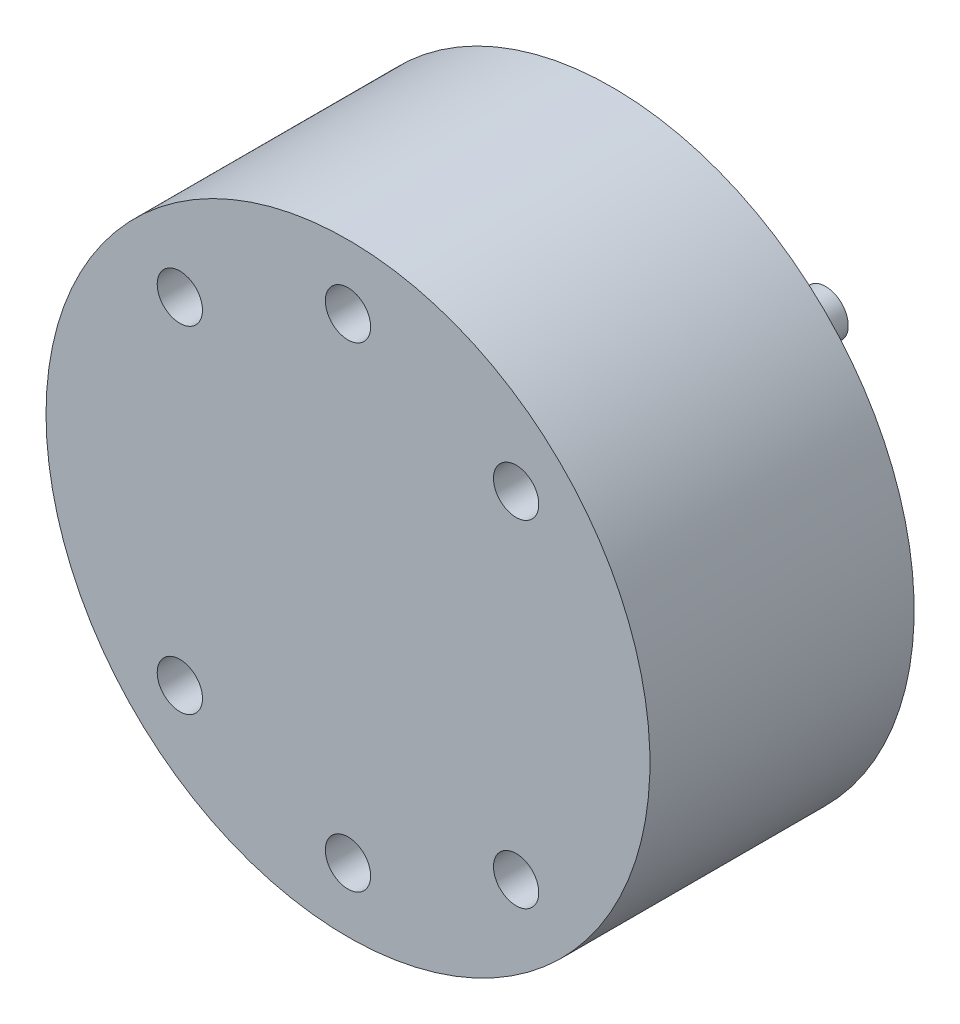
ISO-10303-21;
HEADER;
FILE_DESCRIPTION(('STEP AP214'),'2;1');
FILE_NAME('part.step','',(''),(''),'','','');
FILE_SCHEMA(('AUTOMOTIVE_DESIGN { 1 0 10303 214 1 1 1 1 }'));
ENDSEC;
DATA;
#1=APPLICATION_CONTEXT('core data for automotive mechanical design processes');
#2=APPLICATION_PROTOCOL_DEFINITION('international standard','automotive_design',2000,#1);
#3=PRODUCT_CONTEXT('',#1,'mechanical');
#4=PRODUCT('Part','Part','',(#3));
#5=PRODUCT_RELATED_PRODUCT_CATEGORY('part','',(#4));
#6=PRODUCT_DEFINITION_FORMATION('','',#4);
#7=PRODUCT_DEFINITION_CONTEXT('part definition',#1,'design');
#8=PRODUCT_DEFINITION('design','',#6,#7);
#9=PRODUCT_DEFINITION_SHAPE('','',#8);
#10=(LENGTH_UNIT() NAMED_UNIT(*) SI_UNIT(.MILLI.,.METRE.));
#11=(NAMED_UNIT(*) PLANE_ANGLE_UNIT() SI_UNIT($,.RADIAN.));
#12=(NAMED_UNIT(*) SI_UNIT($,.STERADIAN.) SOLID_ANGLE_UNIT());
#13=UNCERTAINTY_MEASURE_WITH_UNIT(LENGTH_MEASURE(1.E-05),#10,'distance_accuracy_value','');
#14=(GEOMETRIC_REPRESENTATION_CONTEXT(3) GLOBAL_UNCERTAINTY_ASSIGNED_CONTEXT((#13)) GLOBAL_UNIT_ASSIGNED_CONTEXT((#10,
#11,#12)) REPRESENTATION_CONTEXT('',''));
#15=CARTESIAN_POINT('',(0.,0.,0.));
#16=DIRECTION('',(0.,0.,1.));
#17=DIRECTION('',(1.,0.,0.));
#18=AXIS2_PLACEMENT_3D('',#15,#16,#17);
#19=CARTESIAN_POINT('',(0.,0.,0.));
#20=DIRECTION('',(0.,0.,1.));
#21=DIRECTION('',(1.,0.,0.));
#22=AXIS2_PLACEMENT_3D('',#19,#20,#21);
#23=PLANE('',#22);
#24=CARTESIAN_POINT('',(-22.2738636073763,22.2738636073763,0.));
#25=DIRECTION('',(0.,0.,-1.));
#26=DIRECTION('',(1.,0.,0.));
#27=AXIS2_PLACEMENT_3D('',#24,#25,#26);
#28=CIRCLE('',#27,3.);
#29=CARTESIAN_POINT('',(-25.2738636073763,22.2738636073763,0.));
#30=VERTEX_POINT('',#29);
#31=EDGE_CURVE('E175',#30,#30,#28,.T.);
#32=ORIENTED_EDGE('',*,*,#31,.F.);
#33=EDGE_LOOP('',(#32));
#34=FACE_BOUND('',#33,.T.);
#35=CARTESIAN_POINT('',(0.,-31.5,0.));
#36=DIRECTION('',(0.,0.,-1.));
#37=DIRECTION('',(1.,0.,0.));
#38=AXIS2_PLACEMENT_3D('',#35,#36,#37);
#39=CIRCLE('',#38,3.);
#40=CARTESIAN_POINT('',(-3.,-31.5,0.));
#41=VERTEX_POINT('',#40);
#42=EDGE_CURVE('E146',#41,#41,#39,.T.);
#43=ORIENTED_EDGE('',*,*,#42,.F.);
#44=EDGE_LOOP('',(#43));
#45=FACE_BOUND('',#44,.T.);
#46=CARTESIAN_POINT('',(22.2738636073763,22.2738636073763,0.));
#47=DIRECTION('',(0.,0.,-1.));
#48=DIRECTION('',(1.,0.,0.));
#49=AXIS2_PLACEMENT_3D('',#46,#47,#48);
#50=CIRCLE('',#49,3.);
#51=CARTESIAN_POINT('',(19.2738636073762,22.2738636073763,0.));
#52=VERTEX_POINT('',#51);
#53=EDGE_CURVE('E19',#52,#52,#50,.T.);
#54=ORIENTED_EDGE('',*,*,#53,.F.);
#55=EDGE_LOOP('',(#54));
#56=FACE_BOUND('',#55,.T.);
#57=CARTESIAN_POINT('',(22.2738636073762,-22.2738636073763,0.));
#58=DIRECTION('',(0.,0.,-1.));
#59=DIRECTION('',(1.,0.,0.));
#60=AXIS2_PLACEMENT_3D('',#57,#58,#59);
#61=CIRCLE('',#60,3.);
#62=CARTESIAN_POINT('',(19.2738636073762,-22.2738636073763,0.));
#63=VERTEX_POINT('',#62);
#64=EDGE_CURVE('E195',#63,#63,#61,.T.);
#65=ORIENTED_EDGE('',*,*,#64,.F.);
#66=EDGE_LOOP('',(#65));
#67=FACE_BOUND('',#66,.T.);
#68=CARTESIAN_POINT('',(-22.2738636073763,-22.2738636073762,0.));
#69=DIRECTION('',(0.,0.,-1.));
#70=DIRECTION('',(1.,0.,0.));
#71=AXIS2_PLACEMENT_3D('',#68,#69,#70);
#72=CIRCLE('',#71,3.);
#73=CARTESIAN_POINT('',(-25.2738636073763,-22.2738636073762,0.));
#74=VERTEX_POINT('',#73);
#75=EDGE_CURVE('E136',#74,#74,#72,.T.);
#76=ORIENTED_EDGE('',*,*,#75,.F.);
#77=EDGE_LOOP('',(#76));
#78=FACE_BOUND('',#77,.T.);
#79=CARTESIAN_POINT('',(0.,31.5,0.));
#80=DIRECTION('',(0.,0.,-1.));
#81=DIRECTION('',(1.,0.,0.));
#82=AXIS2_PLACEMENT_3D('',#79,#80,#81);
#83=CIRCLE('',#82,3.);
#84=CARTESIAN_POINT('',(-3.,31.5,0.));
#85=VERTEX_POINT('',#84);
#86=EDGE_CURVE('E167',#85,#85,#83,.T.);
#87=ORIENTED_EDGE('',*,*,#86,.F.);
#88=EDGE_LOOP('',(#87));
#89=FACE_BOUND('',#88,.T.);
#90=CARTESIAN_POINT('',(0.,0.,0.));
#91=DIRECTION('',(0.,0.,1.));
#92=DIRECTION('',(1.,0.,0.));
#93=AXIS2_PLACEMENT_3D('',#90,#91,#92);
#94=CIRCLE('',#93,40.);
#95=CARTESIAN_POINT('',(-40.,0.,0.));
#96=VERTEX_POINT('',#95);
#97=EDGE_CURVE('E9',#96,#96,#94,.T.);
#98=ORIENTED_EDGE('',*,*,#97,.F.);
#99=EDGE_LOOP('',(#98));
#100=FACE_BOUND('',#99,.T.);
#101=ADVANCED_FACE('F15',(#34,#45,#56,#67,#78,#89,#100),#23,.F.);
#102=CARTESIAN_POINT('',(0.,0.,35.));
#103=DIRECTION('',(0.,0.,1.));
#104=DIRECTION('',(1.,0.,0.));
#105=AXIS2_PLACEMENT_3D('',#102,#103,#104);
#106=PLANE('',#105);
#107=CARTESIAN_POINT('',(-22.2738636073763,22.2738636073763,35.));
#108=DIRECTION('',(0.,0.,-1.));
#109=DIRECTION('',(1.,0.,0.));
#110=AXIS2_PLACEMENT_3D('',#107,#108,#109);
#111=CIRCLE('',#110,3.);
#112=CARTESIAN_POINT('',(-25.2738636073763,22.2738636073763,35.));
#113=VERTEX_POINT('',#112);
#114=EDGE_CURVE('E164',#113,#113,#111,.T.);
#115=ORIENTED_EDGE('',*,*,#114,.T.);
#116=EDGE_LOOP('',(#115));
#117=FACE_BOUND('',#116,.T.);
#118=CARTESIAN_POINT('',(0.,-31.5,35.));
#119=DIRECTION('',(0.,0.,-1.));
#120=DIRECTION('',(1.,0.,0.));
#121=AXIS2_PLACEMENT_3D('',#118,#119,#120);
#122=CIRCLE('',#121,3.);
#123=CARTESIAN_POINT('',(-3.,-31.5,35.));
#124=VERTEX_POINT('',#123);
#125=EDGE_CURVE('E147',#124,#124,#122,.T.);
#126=ORIENTED_EDGE('',*,*,#125,.T.);
#127=EDGE_LOOP('',(#126));
#128=FACE_BOUND('',#127,.T.);
#129=CARTESIAN_POINT('',(22.2738636073763,22.2738636073763,35.));
#130=DIRECTION('',(0.,0.,-1.));
#131=DIRECTION('',(1.,0.,0.));
#132=AXIS2_PLACEMENT_3D('',#129,#130,#131);
#133=CIRCLE('',#132,3.);
#134=CARTESIAN_POINT('',(19.2738636073763,22.2738636073763,35.));
#135=VERTEX_POINT('',#134);
#136=EDGE_CURVE('E133',#135,#135,#133,.T.);
#137=ORIENTED_EDGE('',*,*,#136,.T.);
#138=EDGE_LOOP('',(#137));
#139=FACE_BOUND('',#138,.T.);
#140=CARTESIAN_POINT('',(22.2738636073762,-22.2738636073763,35.));
#141=DIRECTION('',(0.,0.,-1.));
#142=DIRECTION('',(1.,0.,0.));
#143=AXIS2_PLACEMENT_3D('',#140,#141,#142);
#144=CIRCLE('',#143,3.);
#145=CARTESIAN_POINT('',(19.2738636073763,-22.2738636073763,35.));
#146=VERTEX_POINT('',#145);
#147=EDGE_CURVE('E117',#146,#146,#144,.T.);
#148=ORIENTED_EDGE('',*,*,#147,.T.);
#149=EDGE_LOOP('',(#148));
#150=FACE_BOUND('',#149,.T.);
#151=CARTESIAN_POINT('',(-22.2738636073763,-22.2738636073762,35.));
#152=DIRECTION('',(0.,0.,-1.));
#153=DIRECTION('',(1.,0.,0.));
#154=AXIS2_PLACEMENT_3D('',#151,#152,#153);
#155=CIRCLE('',#154,3.);
#156=CARTESIAN_POINT('',(-25.2738636073763,-22.2738636073762,35.));
#157=VERTEX_POINT('',#156);
#158=EDGE_CURVE('E121',#157,#157,#155,.T.);
#159=ORIENTED_EDGE('',*,*,#158,.T.);
#160=EDGE_LOOP('',(#159));
#161=FACE_BOUND('',#160,.T.);
#162=CARTESIAN_POINT('',(0.,31.5,35.));
#163=DIRECTION('',(0.,0.,-1.));
#164=DIRECTION('',(1.,0.,0.));
#165=AXIS2_PLACEMENT_3D('',#162,#163,#164);
#166=CIRCLE('',#165,3.);
#167=CARTESIAN_POINT('',(-3.,31.5,35.));
#168=VERTEX_POINT('',#167);
#169=EDGE_CURVE('E198',#168,#168,#166,.T.);
#170=ORIENTED_EDGE('',*,*,#169,.T.);
#171=EDGE_LOOP('',(#170));
#172=FACE_BOUND('',#171,.T.);
#173=CARTESIAN_POINT('',(0.,0.,35.));
#174=DIRECTION('',(0.,0.,1.));
#175=DIRECTION('',(1.,0.,0.));
#176=AXIS2_PLACEMENT_3D('',#173,#174,#175);
#177=CIRCLE('',#176,40.);
#178=CARTESIAN_POINT('',(-40.,0.,35.));
#179=VERTEX_POINT('',#178);
#180=EDGE_CURVE('E171',#179,#179,#177,.T.);
#181=ORIENTED_EDGE('',*,*,#180,.T.);
#182=EDGE_LOOP('',(#181));
#183=FACE_BOUND('',#182,.T.);
#184=ADVANCED_FACE('F124',(#117,#128,#139,#150,#161,#172,#183),#106,.T.);
#185=CARTESIAN_POINT('',(0.,0.,0.));
#186=DIRECTION('',(0.,0.,1.));
#187=DIRECTION('',(1.,0.,0.));
#188=AXIS2_PLACEMENT_3D('',#185,#186,#187);
#189=CYLINDRICAL_SURFACE('',#188,40.);
#190=ORIENTED_EDGE('',*,*,#180,.F.);
#191=DIRECTION('',(0.,0.,-1.));
#192=VECTOR('',#191,1.);
#193=CARTESIAN_POINT('',(-40.,0.,0.));
#194=LINE('',#193,#192);
#195=EDGE_CURVE('E26',#179,#96,#194,.T.);
#196=ORIENTED_EDGE('',*,*,#195,.T.);
#197=ORIENTED_EDGE('',*,*,#97,.T.);
#198=ORIENTED_EDGE('',*,*,#195,.F.);
#199=EDGE_LOOP('',(#190,#196,#197,#198));
#200=FACE_BOUND('',#199,.T.);
#201=ADVANCED_FACE('F273',(#200),#189,.T.);
#202=CARTESIAN_POINT('',(0.,31.5,0.));
#203=DIRECTION('',(0.,0.,1.));
#204=DIRECTION('',(1.,0.,0.));
#205=AXIS2_PLACEMENT_3D('',#202,#203,#204);
#206=CYLINDRICAL_SURFACE('',#205,3.);
#207=ORIENTED_EDGE('',*,*,#169,.F.);
#208=DIRECTION('',(0.,0.,-1.));
#209=VECTOR('',#208,1.);
#210=CARTESIAN_POINT('',(-3.,31.5,0.));
#211=LINE('',#210,#209);
#212=EDGE_CURVE('E172',#168,#85,#211,.T.);
#213=ORIENTED_EDGE('',*,*,#212,.T.);
#214=ORIENTED_EDGE('',*,*,#86,.T.);
#215=ORIENTED_EDGE('',*,*,#212,.F.);
#216=EDGE_LOOP('',(#207,#213,#214,#215));
#217=FACE_BOUND('',#216,.T.);
#218=ADVANCED_FACE('F291',(#217),#206,.F.);
#219=CARTESIAN_POINT('',(-22.2738636073763,-22.2738636073762,0.));
#220=DIRECTION('',(0.,0.,1.));
#221=DIRECTION('',(1.,0.,0.));
#222=AXIS2_PLACEMENT_3D('',#219,#220,#221);
#223=CYLINDRICAL_SURFACE('',#222,3.);
#224=ORIENTED_EDGE('',*,*,#158,.F.);
#225=DIRECTION('',(0.,0.,-1.));
#226=VECTOR('',#225,1.);
#227=CARTESIAN_POINT('',(-25.2738636073763,-22.2738636073762,0.));
#228=LINE('',#227,#226);
#229=CARTESIAN_POINT('',(-25.2738636073763,-22.2738636073763,28.));
#230=VERTEX_POINT('',#229);
#231=EDGE_CURVE('E189',#157,#230,#228,.T.);
#232=ORIENTED_EDGE('',*,*,#231,.T.);
#233=CARTESIAN_POINT('',(-22.2738636073763,-22.2738636073762,28.));
#234=DIRECTION('',(0.,0.,-1.));
#235=DIRECTION('',(1.,0.,0.));
#236=AXIS2_PLACEMENT_3D('',#233,#234,#235);
#237=CIRCLE('',#236,3.);
#238=EDGE_CURVE('E185',#230,#230,#237,.T.);
#239=ORIENTED_EDGE('',*,*,#238,.T.);
#240=ORIENTED_EDGE('',*,*,#231,.F.);
#241=EDGE_LOOP('',(#224,#232,#239,#240));
#242=FACE_BOUND('',#241,.T.);
#243=ADVANCED_FACE('F294',(#242),#223,.F.);
#244=CARTESIAN_POINT('',(22.2738636073762,-22.2738636073763,0.));
#245=DIRECTION('',(0.,0.,1.));
#246=DIRECTION('',(1.,0.,0.));
#247=AXIS2_PLACEMENT_3D('',#244,#245,#246);
#248=CYLINDRICAL_SURFACE('',#247,3.);
#249=ORIENTED_EDGE('',*,*,#147,.F.);
#250=DIRECTION('',(0.,0.,-1.));
#251=VECTOR('',#250,1.);
#252=CARTESIAN_POINT('',(19.2738636073762,-22.2738636073763,0.));
#253=LINE('',#252,#251);
#254=CARTESIAN_POINT('',(19.2738636073762,-22.2738636073763,28.));
#255=VERTEX_POINT('',#254);
#256=EDGE_CURVE('E114',#146,#255,#253,.T.);
#257=ORIENTED_EDGE('',*,*,#256,.T.);
#258=CARTESIAN_POINT('',(22.2738636073762,-22.2738636073763,28.));
#259=DIRECTION('',(0.,0.,-1.));
#260=DIRECTION('',(1.,0.,0.));
#261=AXIS2_PLACEMENT_3D('',#258,#259,#260);
#262=CIRCLE('',#261,3.);
#263=EDGE_CURVE('E119',#255,#255,#262,.T.);
#264=ORIENTED_EDGE('',*,*,#263,.T.);
#265=ORIENTED_EDGE('',*,*,#256,.F.);
#266=EDGE_LOOP('',(#249,#257,#264,#265));
#267=FACE_BOUND('',#266,.T.);
#268=ADVANCED_FACE('F116',(#267),#248,.F.);
#269=CARTESIAN_POINT('',(22.2738636073763,22.2738636073763,0.));
#270=DIRECTION('',(0.,0.,1.));
#271=DIRECTION('',(1.,0.,0.));
#272=AXIS2_PLACEMENT_3D('',#269,#270,#271);
#273=CYLINDRICAL_SURFACE('',#272,3.);
#274=ORIENTED_EDGE('',*,*,#136,.F.);
#275=DIRECTION('',(0.,0.,-1.));
#276=VECTOR('',#275,1.);
#277=CARTESIAN_POINT('',(19.2738636073762,22.2738636073763,0.));
#278=LINE('',#277,#276);
#279=CARTESIAN_POINT('',(19.2738636073763,22.2738636073762,28.));
#280=VERTEX_POINT('',#279);
#281=EDGE_CURVE('E127',#135,#280,#278,.T.);
#282=ORIENTED_EDGE('',*,*,#281,.T.);
#283=CARTESIAN_POINT('',(22.2738636073763,22.2738636073763,28.));
#284=DIRECTION('',(0.,0.,-1.));
#285=DIRECTION('',(1.,0.,0.));
#286=AXIS2_PLACEMENT_3D('',#283,#284,#285);
#287=CIRCLE('',#286,3.);
#288=EDGE_CURVE('E205',#280,#280,#287,.T.);
#289=ORIENTED_EDGE('',*,*,#288,.T.);
#290=ORIENTED_EDGE('',*,*,#281,.F.);
#291=EDGE_LOOP('',(#274,#282,#289,#290));
#292=FACE_BOUND('',#291,.T.);
#293=ADVANCED_FACE('F287',(#292),#273,.F.);
#294=CARTESIAN_POINT('',(0.,-31.5,0.));
#295=DIRECTION('',(0.,0.,1.));
#296=DIRECTION('',(1.,0.,0.));
#297=AXIS2_PLACEMENT_3D('',#294,#295,#296);
#298=CYLINDRICAL_SURFACE('',#297,3.);
#299=ORIENTED_EDGE('',*,*,#125,.F.);
#300=DIRECTION('',(0.,0.,-1.));
#301=VECTOR('',#300,1.);
#302=CARTESIAN_POINT('',(-3.,-31.5,0.));
#303=LINE('',#302,#301);
#304=EDGE_CURVE('E143',#124,#41,#303,.T.);
#305=ORIENTED_EDGE('',*,*,#304,.T.);
#306=ORIENTED_EDGE('',*,*,#42,.T.);
#307=ORIENTED_EDGE('',*,*,#304,.F.);
#308=EDGE_LOOP('',(#299,#305,#306,#307));
#309=FACE_BOUND('',#308,.T.);
#310=ADVANCED_FACE('F265',(#309),#298,.F.);
#311=CARTESIAN_POINT('',(-22.2738636073763,22.2738636073763,0.));
#312=DIRECTION('',(0.,0.,1.));
#313=DIRECTION('',(1.,0.,0.));
#314=AXIS2_PLACEMENT_3D('',#311,#312,#313);
#315=CYLINDRICAL_SURFACE('',#314,3.);
#316=ORIENTED_EDGE('',*,*,#114,.F.);
#317=DIRECTION('',(0.,0.,-1.));
#318=VECTOR('',#317,1.);
#319=CARTESIAN_POINT('',(-25.2738636073763,22.2738636073763,0.));
#320=LINE('',#319,#318);
#321=CARTESIAN_POINT('',(-25.2738636073763,22.2738636073763,28.));
#322=VERTEX_POINT('',#321);
#323=EDGE_CURVE('E157',#113,#322,#320,.T.);
#324=ORIENTED_EDGE('',*,*,#323,.T.);
#325=CARTESIAN_POINT('',(-22.2738636073763,22.2738636073763,28.));
#326=DIRECTION('',(0.,0.,-1.));
#327=DIRECTION('',(1.,0.,0.));
#328=AXIS2_PLACEMENT_3D('',#325,#326,#327);
#329=CIRCLE('',#328,3.);
#330=EDGE_CURVE('E141',#322,#322,#329,.T.);
#331=ORIENTED_EDGE('',*,*,#330,.T.);
#332=ORIENTED_EDGE('',*,*,#323,.F.);
#333=EDGE_LOOP('',(#316,#324,#331,#332));
#334=FACE_BOUND('',#333,.T.);
#335=ADVANCED_FACE('F252',(#334),#315,.F.);
#336=CARTESIAN_POINT('',(-22.2738636073763,22.2738636073763,28.));
#337=DIRECTION('',(0.,0.,1.));
#338=DIRECTION('',(1.,0.,0.));
#339=AXIS2_PLACEMENT_3D('',#336,#337,#338);
#340=PLANE('',#339);
#341=ORIENTED_EDGE('',*,*,#330,.F.);
#342=EDGE_LOOP('',(#341));
#343=FACE_BOUND('',#342,.T.);
#344=ADVANCED_FACE('F17',(#343),#340,.T.);
#345=CARTESIAN_POINT('',(-22.2738636073763,22.2738636073763,-6.));
#346=DIRECTION('',(0.,0.,1.));
#347=DIRECTION('',(1.,0.,0.));
#348=AXIS2_PLACEMENT_3D('',#345,#346,#347);
#349=PLANE('',#348);
#350=CARTESIAN_POINT('',(-22.2738636073763,22.2738636073763,-6.));
#351=DIRECTION('',(0.,0.,-1.));
#352=DIRECTION('',(1.,0.,0.));
#353=AXIS2_PLACEMENT_3D('',#350,#351,#352);
#354=CIRCLE('',#353,3.);
#355=CARTESIAN_POINT('',(-25.2738636073763,22.2738636073763,-6.));
#356=VERTEX_POINT('',#355);
#357=EDGE_CURVE('E139',#356,#356,#354,.T.);
#358=ORIENTED_EDGE('',*,*,#357,.T.);
#359=EDGE_LOOP('',(#358));
#360=FACE_BOUND('',#359,.T.);
#361=ADVANCED_FACE('F256',(#360),#349,.F.);
#362=CARTESIAN_POINT('',(-22.2738636073763,22.2738636073763,0.));
#363=DIRECTION('',(0.,0.,1.));
#364=DIRECTION('',(1.,0.,0.));
#365=AXIS2_PLACEMENT_3D('',#362,#363,#364);
#366=CYLINDRICAL_SURFACE('',#365,3.);
#367=ORIENTED_EDGE('',*,*,#31,.T.);
#368=DIRECTION('',(0.,0.,-1.));
#369=VECTOR('',#368,1.);
#370=CARTESIAN_POINT('',(-25.2738636073763,22.2738636073763,0.));
#371=LINE('',#370,#369);
#372=EDGE_CURVE('E142',#30,#356,#371,.T.);
#373=ORIENTED_EDGE('',*,*,#372,.T.);
#374=ORIENTED_EDGE('',*,*,#357,.F.);
#375=ORIENTED_EDGE('',*,*,#372,.F.);
#376=EDGE_LOOP('',(#367,#373,#374,#375));
#377=FACE_BOUND('',#376,.T.);
#378=ADVANCED_FACE('F262',(#377),#366,.T.);
#379=CARTESIAN_POINT('',(-22.2738636073763,-22.2738636073763,28.));
#380=DIRECTION('',(0.,0.,1.));
#381=DIRECTION('',(1.,0.,0.));
#382=AXIS2_PLACEMENT_3D('',#379,#380,#381);
#383=PLANE('',#382);
#384=ORIENTED_EDGE('',*,*,#238,.F.);
#385=EDGE_LOOP('',(#384));
#386=FACE_BOUND('',#385,.T.);
#387=ADVANCED_FACE('F299',(#386),#383,.T.);
#388=CARTESIAN_POINT('',(-22.2738636073763,-22.2738636073763,-6.));
#389=DIRECTION('',(0.,0.,1.));
#390=DIRECTION('',(1.,0.,0.));
#391=AXIS2_PLACEMENT_3D('',#388,#389,#390);
#392=PLANE('',#391);
#393=CARTESIAN_POINT('',(-22.2738636073763,-22.2738636073763,-6.));
#394=DIRECTION('',(0.,0.,-1.));
#395=DIRECTION('',(1.,0.,0.));
#396=AXIS2_PLACEMENT_3D('',#393,#394,#395);
#397=CIRCLE('',#396,3.);
#398=CARTESIAN_POINT('',(-25.2738636073763,-22.2738636073763,-6.));
#399=VERTEX_POINT('',#398);
#400=EDGE_CURVE('E181',#399,#399,#397,.T.);
#401=ORIENTED_EDGE('',*,*,#400,.T.);
#402=EDGE_LOOP('',(#401));
#403=FACE_BOUND('',#402,.T.);
#404=ADVANCED_FACE('F296',(#403),#392,.F.);
#405=CARTESIAN_POINT('',(-22.2738636073763,-22.2738636073763,0.));
#406=DIRECTION('',(0.,0.,1.));
#407=DIRECTION('',(1.,0.,0.));
#408=AXIS2_PLACEMENT_3D('',#405,#406,#407);
#409=CYLINDRICAL_SURFACE('',#408,3.);
#410=ORIENTED_EDGE('',*,*,#75,.T.);
#411=DIRECTION('',(0.,0.,-1.));
#412=VECTOR('',#411,1.);
#413=CARTESIAN_POINT('',(-25.2738636073763,-22.2738636073763,0.));
#414=LINE('',#413,#412);
#415=EDGE_CURVE('E177',#74,#399,#414,.T.);
#416=ORIENTED_EDGE('',*,*,#415,.T.);
#417=ORIENTED_EDGE('',*,*,#400,.F.);
#418=ORIENTED_EDGE('',*,*,#415,.F.);
#419=EDGE_LOOP('',(#410,#416,#417,#418));
#420=FACE_BOUND('',#419,.T.);
#421=ADVANCED_FACE('F280',(#420),#409,.T.);
#422=CARTESIAN_POINT('',(22.2738636073763,22.2738636073762,28.));
#423=DIRECTION('',(0.,0.,1.));
#424=DIRECTION('',(1.,0.,0.));
#425=AXIS2_PLACEMENT_3D('',#422,#423,#424);
#426=PLANE('',#425);
#427=ORIENTED_EDGE('',*,*,#288,.F.);
#428=EDGE_LOOP('',(#427));
#429=FACE_BOUND('',#428,.T.);
#430=ADVANCED_FACE('F316',(#429),#426,.T.);
#431=CARTESIAN_POINT('',(22.2738636073763,22.2738636073762,-6.));
#432=DIRECTION('',(0.,0.,1.));
#433=DIRECTION('',(1.,0.,0.));
#434=AXIS2_PLACEMENT_3D('',#431,#432,#433);
#435=PLANE('',#434);
#436=CARTESIAN_POINT('',(22.2738636073763,22.2738636073762,-6.));
#437=DIRECTION('',(0.,0.,-1.));
#438=DIRECTION('',(1.,0.,0.));
#439=AXIS2_PLACEMENT_3D('',#436,#437,#438);
#440=CIRCLE('',#439,3.);
#441=CARTESIAN_POINT('',(19.2738636073763,22.2738636073762,-6.));
#442=VERTEX_POINT('',#441);
#443=EDGE_CURVE('E208',#442,#442,#440,.T.);
#444=ORIENTED_EDGE('',*,*,#443,.T.);
#445=EDGE_LOOP('',(#444));
#446=FACE_BOUND('',#445,.T.);
#447=ADVANCED_FACE('F318',(#446),#435,.F.);
#448=CARTESIAN_POINT('',(22.2738636073763,22.2738636073762,0.));
#449=DIRECTION('',(0.,0.,1.));
#450=DIRECTION('',(1.,0.,0.));
#451=AXIS2_PLACEMENT_3D('',#448,#449,#450);
#452=CYLINDRICAL_SURFACE('',#451,3.);
#453=ORIENTED_EDGE('',*,*,#53,.T.);
#454=DIRECTION('',(0.,0.,-1.));
#455=VECTOR('',#454,1.);
#456=CARTESIAN_POINT('',(19.2738636073763,22.2738636073762,0.));
#457=LINE('',#456,#455);
#458=EDGE_CURVE('E223',#52,#442,#457,.T.);
#459=ORIENTED_EDGE('',*,*,#458,.T.);
#460=ORIENTED_EDGE('',*,*,#443,.F.);
#461=ORIENTED_EDGE('',*,*,#458,.F.);
#462=EDGE_LOOP('',(#453,#459,#460,#461));
#463=FACE_BOUND('',#462,.T.);
#464=ADVANCED_FACE('F314',(#463),#452,.T.);
#465=CARTESIAN_POINT('',(22.2738636073762,-22.2738636073763,28.));
#466=DIRECTION('',(0.,0.,1.));
#467=DIRECTION('',(1.,0.,0.));
#468=AXIS2_PLACEMENT_3D('',#465,#466,#467);
#469=PLANE('',#468);
#470=ORIENTED_EDGE('',*,*,#263,.F.);
#471=EDGE_LOOP('',(#470));
#472=FACE_BOUND('',#471,.T.);
#473=ADVANCED_FACE('F286',(#472),#469,.T.);
#474=CARTESIAN_POINT('',(22.2738636073762,-22.2738636073763,-6.));
#475=DIRECTION('',(0.,0.,1.));
#476=DIRECTION('',(1.,0.,0.));
#477=AXIS2_PLACEMENT_3D('',#474,#475,#476);
#478=PLANE('',#477);
#479=CARTESIAN_POINT('',(22.2738636073762,-22.2738636073763,-6.));
#480=DIRECTION('',(0.,0.,-1.));
#481=DIRECTION('',(1.,0.,0.));
#482=AXIS2_PLACEMENT_3D('',#479,#480,#481);
#483=CIRCLE('',#482,3.);
#484=CARTESIAN_POINT('',(19.2738636073762,-22.2738636073763,-6.));
#485=VERTEX_POINT('',#484);
#486=EDGE_CURVE('E194',#485,#485,#483,.T.);
#487=ORIENTED_EDGE('',*,*,#486,.T.);
#488=EDGE_LOOP('',(#487));
#489=FACE_BOUND('',#488,.T.);
#490=ADVANCED_FACE('F282',(#489),#478,.F.);
#491=CARTESIAN_POINT('',(22.2738636073762,-22.2738636073763,0.));
#492=DIRECTION('',(0.,0.,1.));
#493=DIRECTION('',(1.,0.,0.));
#494=AXIS2_PLACEMENT_3D('',#491,#492,#493);
#495=CYLINDRICAL_SURFACE('',#494,3.);
#496=ORIENTED_EDGE('',*,*,#64,.T.);
#497=DIRECTION('',(0.,0.,-1.));
#498=VECTOR('',#497,1.);
#499=CARTESIAN_POINT('',(19.2738636073762,-22.2738636073763,0.));
#500=LINE('',#499,#498);
#501=EDGE_CURVE('E190',#63,#485,#500,.T.);
#502=ORIENTED_EDGE('',*,*,#501,.T.);
#503=ORIENTED_EDGE('',*,*,#486,.F.);
#504=ORIENTED_EDGE('',*,*,#501,.F.);
#505=EDGE_LOOP('',(#496,#502,#503,#504));
#506=FACE_BOUND('',#505,.T.);
#507=ADVANCED_FACE('F285',(#506),#495,.T.);
#508=CLOSED_SHELL('',(#101,#184,#201,#218,#243,#268,#293,#310,#335,#344,#361,#378,#387,#404,
#421,#430,#447,#464,#473,#490,#507));
#509=MANIFOLD_SOLID_BREP('B1',#508);
#510=ADVANCED_BREP_SHAPE_REPRESENTATION('',(#18,#509),#14);
#511=SHAPE_DEFINITION_REPRESENTATION(#9,#510);
ENDSEC;
END-ISO-10303-21;
